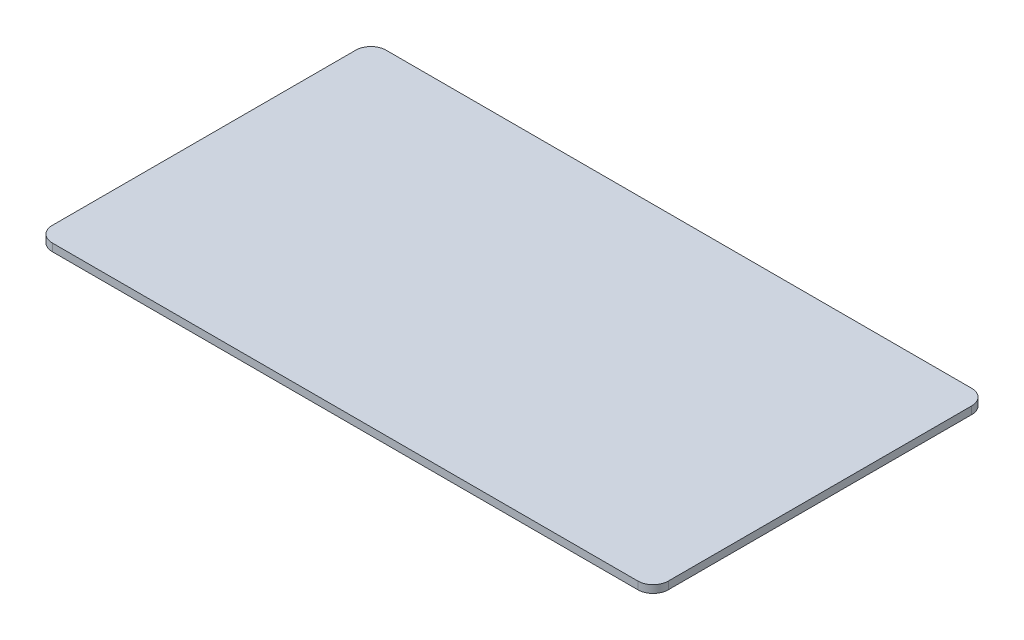
ISO-10303-21;
HEADER;
FILE_DESCRIPTION(('STEP AP214'),'2;1');
FILE_NAME('part.step','',(''),(''),'','','');
FILE_SCHEMA(('AUTOMOTIVE_DESIGN { 1 0 10303 214 1 1 1 1 }'));
ENDSEC;
DATA;
#1=APPLICATION_CONTEXT('core data for automotive mechanical design processes');
#2=APPLICATION_PROTOCOL_DEFINITION('international standard','automotive_design',2000,#1);
#3=PRODUCT_CONTEXT('',#1,'mechanical');
#4=PRODUCT('Part','Part','',(#3));
#5=PRODUCT_RELATED_PRODUCT_CATEGORY('part','',(#4));
#6=PRODUCT_DEFINITION_FORMATION('','',#4);
#7=PRODUCT_DEFINITION_CONTEXT('part definition',#1,'design');
#8=PRODUCT_DEFINITION('design','',#6,#7);
#9=PRODUCT_DEFINITION_SHAPE('','',#8);
#10=(LENGTH_UNIT() NAMED_UNIT(*) SI_UNIT(.MILLI.,.METRE.));
#11=(NAMED_UNIT(*) PLANE_ANGLE_UNIT() SI_UNIT($,.RADIAN.));
#12=(NAMED_UNIT(*) SI_UNIT($,.STERADIAN.) SOLID_ANGLE_UNIT());
#13=UNCERTAINTY_MEASURE_WITH_UNIT(LENGTH_MEASURE(1.E-05),#10,'distance_accuracy_value','');
#14=(GEOMETRIC_REPRESENTATION_CONTEXT(3) GLOBAL_UNCERTAINTY_ASSIGNED_CONTEXT((#13)) GLOBAL_UNIT_ASSIGNED_CONTEXT((#10,
#11,#12)) REPRESENTATION_CONTEXT('',''));
#15=CARTESIAN_POINT('',(0.,0.,0.));
#16=DIRECTION('',(0.,0.,1.));
#17=DIRECTION('',(1.,0.,0.));
#18=AXIS2_PLACEMENT_3D('',#15,#16,#17);
#19=CARTESIAN_POINT('',(60.8,1.5,-32.95));
#20=DIRECTION('',(-1.,0.,0.));
#21=DIRECTION('',(0.,0.,1.));
#22=AXIS2_PLACEMENT_3D('',#19,#20,#21);
#23=PLANE('',#22);
#24=DIRECTION('',(0.,0.,-1.));
#25=VECTOR('',#24,1.);
#26=CARTESIAN_POINT('',(60.8,1.5,-32.95));
#27=LINE('',#26,#25);
#28=CARTESIAN_POINT('',(60.8,1.5,29.95));
#29=VERTEX_POINT('',#28);
#30=CARTESIAN_POINT('',(60.8,1.5,-29.95));
#31=VERTEX_POINT('',#30);
#32=EDGE_CURVE('E123',#29,#31,#27,.T.);
#33=ORIENTED_EDGE('',*,*,#32,.F.);
#34=DIRECTION('',(0.,-1.,0.));
#35=VECTOR('',#34,1.);
#36=CARTESIAN_POINT('',(60.8,1.5,29.95));
#37=LINE('',#36,#35);
#38=CARTESIAN_POINT('',(60.8,0.,29.95));
#39=VERTEX_POINT('',#38);
#40=EDGE_CURVE('E108',#29,#39,#37,.T.);
#41=ORIENTED_EDGE('',*,*,#40,.T.);
#42=DIRECTION('',(0.,0.,-1.));
#43=VECTOR('',#42,1.);
#44=CARTESIAN_POINT('',(60.8,0.,-32.95));
#45=LINE('',#44,#43);
#46=CARTESIAN_POINT('',(60.8,0.,-29.95));
#47=VERTEX_POINT('',#46);
#48=EDGE_CURVE('E120',#39,#47,#45,.T.);
#49=ORIENTED_EDGE('',*,*,#48,.T.);
#50=DIRECTION('',(0.,-1.,0.));
#51=VECTOR('',#50,1.);
#52=CARTESIAN_POINT('',(60.8,1.5,-29.95));
#53=LINE('',#52,#51);
#54=EDGE_CURVE('E125',#47,#31,#53,.F.);
#55=ORIENTED_EDGE('',*,*,#54,.T.);
#56=EDGE_LOOP('',(#33,#41,#49,#55));
#57=FACE_BOUND('',#56,.T.);
#58=ADVANCED_FACE('F38',(#57),#23,.F.);
#59=CARTESIAN_POINT('',(-60.8,1.5,-32.95));
#60=DIRECTION('',(0.,0.,1.));
#61=DIRECTION('',(1.,0.,0.));
#62=AXIS2_PLACEMENT_3D('',#59,#60,#61);
#63=PLANE('',#62);
#64=DIRECTION('',(-1.,0.,0.));
#65=VECTOR('',#64,1.);
#66=CARTESIAN_POINT('',(-60.8,1.5,-32.95));
#67=LINE('',#66,#65);
#68=CARTESIAN_POINT('',(57.8,1.5,-32.95));
#69=VERTEX_POINT('',#68);
#70=CARTESIAN_POINT('',(-57.8,1.5,-32.95));
#71=VERTEX_POINT('',#70);
#72=EDGE_CURVE('E165',#69,#71,#67,.T.);
#73=ORIENTED_EDGE('',*,*,#72,.F.);
#74=DIRECTION('',(0.,-1.,0.));
#75=VECTOR('',#74,1.);
#76=CARTESIAN_POINT('',(57.8,1.5,-32.95));
#77=LINE('',#76,#75);
#78=CARTESIAN_POINT('',(57.8,0.,-32.95));
#79=VERTEX_POINT('',#78);
#80=EDGE_CURVE('E158',#69,#79,#77,.T.);
#81=ORIENTED_EDGE('',*,*,#80,.T.);
#82=DIRECTION('',(-1.,0.,0.));
#83=VECTOR('',#82,1.);
#84=CARTESIAN_POINT('',(-60.8,0.,-32.95));
#85=LINE('',#84,#83);
#86=CARTESIAN_POINT('',(-57.8,0.,-32.95));
#87=VERTEX_POINT('',#86);
#88=EDGE_CURVE('E129',#79,#87,#85,.T.);
#89=ORIENTED_EDGE('',*,*,#88,.T.);
#90=DIRECTION('',(0.,-1.,0.));
#91=VECTOR('',#90,1.);
#92=CARTESIAN_POINT('',(-57.8,1.5,-32.95));
#93=LINE('',#92,#91);
#94=EDGE_CURVE('E156',#87,#71,#93,.F.);
#95=ORIENTED_EDGE('',*,*,#94,.T.);
#96=EDGE_LOOP('',(#73,#81,#89,#95));
#97=FACE_BOUND('',#96,.T.);
#98=ADVANCED_FACE('F163',(#97),#63,.F.);
#99=CARTESIAN_POINT('',(-60.8,1.5,-32.95));
#100=DIRECTION('',(1.,0.,0.));
#101=DIRECTION('',(0.,0.,-1.));
#102=AXIS2_PLACEMENT_3D('',#99,#100,#101);
#103=PLANE('',#102);
#104=DIRECTION('',(0.,0.,1.));
#105=VECTOR('',#104,1.);
#106=CARTESIAN_POINT('',(-60.8,1.5,-32.95));
#107=LINE('',#106,#105);
#108=CARTESIAN_POINT('',(-60.8,1.5,-29.95));
#109=VERTEX_POINT('',#108);
#110=CARTESIAN_POINT('',(-60.8,1.5,29.95));
#111=VERTEX_POINT('',#110);
#112=EDGE_CURVE('E173',#109,#111,#107,.T.);
#113=ORIENTED_EDGE('',*,*,#112,.F.);
#114=DIRECTION('',(0.,-1.,0.));
#115=VECTOR('',#114,1.);
#116=CARTESIAN_POINT('',(-60.8,1.5,-29.95));
#117=LINE('',#116,#115);
#118=CARTESIAN_POINT('',(-60.8,0.,-29.95));
#119=VERTEX_POINT('',#118);
#120=EDGE_CURVE('E11',#109,#119,#117,.T.);
#121=ORIENTED_EDGE('',*,*,#120,.T.);
#122=DIRECTION('',(0.,0.,1.));
#123=VECTOR('',#122,1.);
#124=CARTESIAN_POINT('',(-60.8,0.,-32.95));
#125=LINE('',#124,#123);
#126=CARTESIAN_POINT('',(-60.8,0.,29.95));
#127=VERTEX_POINT('',#126);
#128=EDGE_CURVE('E132',#119,#127,#125,.T.);
#129=ORIENTED_EDGE('',*,*,#128,.T.);
#130=DIRECTION('',(0.,-1.,0.));
#131=VECTOR('',#130,1.);
#132=CARTESIAN_POINT('',(-60.8,1.5,29.95));
#133=LINE('',#132,#131);
#134=EDGE_CURVE('E46',#127,#111,#133,.F.);
#135=ORIENTED_EDGE('',*,*,#134,.T.);
#136=EDGE_LOOP('',(#113,#121,#129,#135));
#137=FACE_BOUND('',#136,.T.);
#138=ADVANCED_FACE('F172',(#137),#103,.F.);
#139=CARTESIAN_POINT('',(-60.8,1.5,32.95));
#140=DIRECTION('',(0.,0.,-1.));
#141=DIRECTION('',(-1.,0.,0.));
#142=AXIS2_PLACEMENT_3D('',#139,#140,#141);
#143=PLANE('',#142);
#144=DIRECTION('',(1.,0.,0.));
#145=VECTOR('',#144,1.);
#146=CARTESIAN_POINT('',(-60.8,0.,32.95));
#147=LINE('',#146,#145);
#148=CARTESIAN_POINT('',(-57.8,0.,32.95));
#149=VERTEX_POINT('',#148);
#150=CARTESIAN_POINT('',(57.8,0.,32.95));
#151=VERTEX_POINT('',#150);
#152=EDGE_CURVE('E139',#149,#151,#147,.T.);
#153=ORIENTED_EDGE('',*,*,#152,.T.);
#154=DIRECTION('',(0.,-1.,0.));
#155=VECTOR('',#154,1.);
#156=CARTESIAN_POINT('',(57.8,1.5,32.95));
#157=LINE('',#156,#155);
#158=CARTESIAN_POINT('',(57.8,1.5,32.95));
#159=VERTEX_POINT('',#158);
#160=EDGE_CURVE('E109',#151,#159,#157,.F.);
#161=ORIENTED_EDGE('',*,*,#160,.T.);
#162=DIRECTION('',(1.,0.,0.));
#163=VECTOR('',#162,1.);
#164=CARTESIAN_POINT('',(-60.8,1.5,32.95));
#165=LINE('',#164,#163);
#166=CARTESIAN_POINT('',(-57.8,1.5,32.95));
#167=VERTEX_POINT('',#166);
#168=EDGE_CURVE('E135',#167,#159,#165,.T.);
#169=ORIENTED_EDGE('',*,*,#168,.F.);
#170=DIRECTION('',(0.,-1.,0.));
#171=VECTOR('',#170,1.);
#172=CARTESIAN_POINT('',(-57.8,1.5,32.95));
#173=LINE('',#172,#171);
#174=EDGE_CURVE('E114',#167,#149,#173,.T.);
#175=ORIENTED_EDGE('',*,*,#174,.T.);
#176=EDGE_LOOP('',(#153,#161,#169,#175));
#177=FACE_BOUND('',#176,.T.);
#178=ADVANCED_FACE('F196',(#177),#143,.F.);
#179=CARTESIAN_POINT('',(0.,1.5,0.));
#180=DIRECTION('',(0.,1.,0.));
#181=DIRECTION('',(0.,0.,1.));
#182=AXIS2_PLACEMENT_3D('',#179,#180,#181);
#183=PLANE('',#182);
#184=ORIENTED_EDGE('',*,*,#168,.T.);
#185=CARTESIAN_POINT('',(57.8,1.5,29.95));
#186=DIRECTION('',(0.,1.,0.));
#187=DIRECTION('',(0.,0.,1.));
#188=AXIS2_PLACEMENT_3D('',#185,#186,#187);
#189=CIRCLE('',#188,3.);
#190=EDGE_CURVE('E154',#159,#29,#189,.T.);
#191=ORIENTED_EDGE('',*,*,#190,.T.);
#192=ORIENTED_EDGE('',*,*,#32,.T.);
#193=CARTESIAN_POINT('',(57.8,1.5,-29.95));
#194=DIRECTION('',(0.,1.,0.));
#195=DIRECTION('',(0.,0.,1.));
#196=AXIS2_PLACEMENT_3D('',#193,#194,#195);
#197=CIRCLE('',#196,3.);
#198=EDGE_CURVE('E152',#31,#69,#197,.T.);
#199=ORIENTED_EDGE('',*,*,#198,.T.);
#200=ORIENTED_EDGE('',*,*,#72,.T.);
#201=CARTESIAN_POINT('',(-57.8,1.5,-29.95));
#202=DIRECTION('',(0.,1.,0.));
#203=DIRECTION('',(0.,0.,1.));
#204=AXIS2_PLACEMENT_3D('',#201,#202,#203);
#205=CIRCLE('',#204,3.);
#206=EDGE_CURVE('E59',#71,#109,#205,.T.);
#207=ORIENTED_EDGE('',*,*,#206,.T.);
#208=ORIENTED_EDGE('',*,*,#112,.T.);
#209=CARTESIAN_POINT('',(-57.8,1.5,29.95));
#210=DIRECTION('',(0.,1.,0.));
#211=DIRECTION('',(0.,0.,1.));
#212=AXIS2_PLACEMENT_3D('',#209,#210,#211);
#213=CIRCLE('',#212,3.);
#214=EDGE_CURVE('E149',#111,#167,#213,.T.);
#215=ORIENTED_EDGE('',*,*,#214,.T.);
#216=EDGE_LOOP('',(#184,#191,#192,#199,#200,#207,#208,#215));
#217=FACE_BOUND('',#216,.T.);
#218=ADVANCED_FACE('F178',(#217),#183,.T.);
#219=CARTESIAN_POINT('',(0.,0.,0.));
#220=DIRECTION('',(0.,1.,0.));
#221=DIRECTION('',(0.,0.,1.));
#222=AXIS2_PLACEMENT_3D('',#219,#220,#221);
#223=PLANE('',#222);
#224=ORIENTED_EDGE('',*,*,#48,.F.);
#225=CARTESIAN_POINT('',(57.8,0.,29.95));
#226=DIRECTION('',(0.,1.,0.));
#227=DIRECTION('',(0.,0.,1.));
#228=AXIS2_PLACEMENT_3D('',#225,#226,#227);
#229=CIRCLE('',#228,3.);
#230=EDGE_CURVE('E104',#39,#151,#229,.F.);
#231=ORIENTED_EDGE('',*,*,#230,.T.);
#232=ORIENTED_EDGE('',*,*,#152,.F.);
#233=CARTESIAN_POINT('',(-57.8,0.,29.95));
#234=DIRECTION('',(0.,1.,0.));
#235=DIRECTION('',(0.,0.,1.));
#236=AXIS2_PLACEMENT_3D('',#233,#234,#235);
#237=CIRCLE('',#236,3.);
#238=EDGE_CURVE('E124',#149,#127,#237,.F.);
#239=ORIENTED_EDGE('',*,*,#238,.T.);
#240=ORIENTED_EDGE('',*,*,#128,.F.);
#241=CARTESIAN_POINT('',(-57.8,0.,-29.95));
#242=DIRECTION('',(0.,1.,0.));
#243=DIRECTION('',(0.,0.,1.));
#244=AXIS2_PLACEMENT_3D('',#241,#242,#243);
#245=CIRCLE('',#244,3.);
#246=EDGE_CURVE('E143',#119,#87,#245,.F.);
#247=ORIENTED_EDGE('',*,*,#246,.T.);
#248=ORIENTED_EDGE('',*,*,#88,.F.);
#249=CARTESIAN_POINT('',(57.8,0.,-29.95));
#250=DIRECTION('',(0.,1.,0.));
#251=DIRECTION('',(0.,0.,1.));
#252=AXIS2_PLACEMENT_3D('',#249,#250,#251);
#253=CIRCLE('',#252,3.);
#254=EDGE_CURVE('E115',#79,#47,#253,.F.);
#255=ORIENTED_EDGE('',*,*,#254,.T.);
#256=EDGE_LOOP('',(#224,#231,#232,#239,#240,#247,#248,#255));
#257=FACE_BOUND('',#256,.T.);
#258=ADVANCED_FACE('F127',(#257),#223,.F.);
#259=CARTESIAN_POINT('',(57.8,1.5,29.95));
#260=DIRECTION('',(0.,-1.,0.));
#261=DIRECTION('',(0.,0.,-1.));
#262=AXIS2_PLACEMENT_3D('',#259,#260,#261);
#263=CYLINDRICAL_SURFACE('',#262,3.);
#264=ORIENTED_EDGE('',*,*,#190,.F.);
#265=ORIENTED_EDGE('',*,*,#160,.F.);
#266=ORIENTED_EDGE('',*,*,#230,.F.);
#267=ORIENTED_EDGE('',*,*,#40,.F.);
#268=EDGE_LOOP('',(#264,#265,#266,#267));
#269=FACE_BOUND('',#268,.T.);
#270=ADVANCED_FACE('F107',(#269),#263,.T.);
#271=CARTESIAN_POINT('',(57.8,1.5,-29.95));
#272=DIRECTION('',(0.,-1.,0.));
#273=DIRECTION('',(0.,0.,-1.));
#274=AXIS2_PLACEMENT_3D('',#271,#272,#273);
#275=CYLINDRICAL_SURFACE('',#274,3.);
#276=ORIENTED_EDGE('',*,*,#198,.F.);
#277=ORIENTED_EDGE('',*,*,#54,.F.);
#278=ORIENTED_EDGE('',*,*,#254,.F.);
#279=ORIENTED_EDGE('',*,*,#80,.F.);
#280=EDGE_LOOP('',(#276,#277,#278,#279));
#281=FACE_BOUND('',#280,.T.);
#282=ADVANCED_FACE('F179',(#281),#275,.T.);
#283=CARTESIAN_POINT('',(-57.8,1.5,-29.95));
#284=DIRECTION('',(0.,-1.,0.));
#285=DIRECTION('',(0.,0.,-1.));
#286=AXIS2_PLACEMENT_3D('',#283,#284,#285);
#287=CYLINDRICAL_SURFACE('',#286,3.);
#288=ORIENTED_EDGE('',*,*,#206,.F.);
#289=ORIENTED_EDGE('',*,*,#94,.F.);
#290=ORIENTED_EDGE('',*,*,#246,.F.);
#291=ORIENTED_EDGE('',*,*,#120,.F.);
#292=EDGE_LOOP('',(#288,#289,#290,#291));
#293=FACE_BOUND('',#292,.T.);
#294=ADVANCED_FACE('F171',(#293),#287,.T.);
#295=CARTESIAN_POINT('',(-57.8,1.5,29.95));
#296=DIRECTION('',(0.,-1.,0.));
#297=DIRECTION('',(0.,0.,-1.));
#298=AXIS2_PLACEMENT_3D('',#295,#296,#297);
#299=CYLINDRICAL_SURFACE('',#298,3.);
#300=ORIENTED_EDGE('',*,*,#214,.F.);
#301=ORIENTED_EDGE('',*,*,#134,.F.);
#302=ORIENTED_EDGE('',*,*,#238,.F.);
#303=ORIENTED_EDGE('',*,*,#174,.F.);
#304=EDGE_LOOP('',(#300,#301,#302,#303));
#305=FACE_BOUND('',#304,.T.);
#306=ADVANCED_FACE('F40',(#305),#299,.T.);
#307=CLOSED_SHELL('',(#58,#98,#138,#178,#218,#258,#270,#282,#294,#306));
#308=MANIFOLD_SOLID_BREP('B2',#307);
#309=ADVANCED_BREP_SHAPE_REPRESENTATION('',(#18,#308),#14);
#310=SHAPE_DEFINITION_REPRESENTATION(#9,#309);
ENDSEC;
END-ISO-10303-21;
